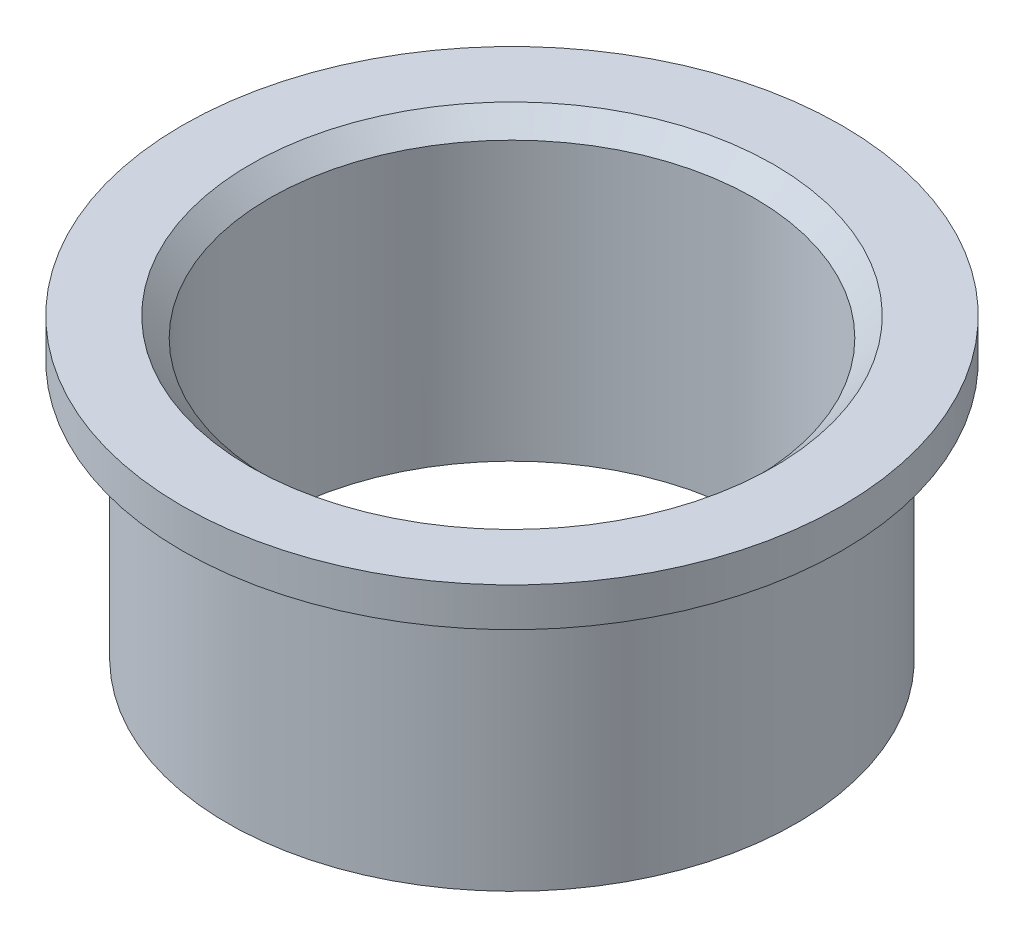
ISO-10303-21;
HEADER;
FILE_DESCRIPTION(('STEP AP214'),'2;1');
FILE_NAME('part.step','',(''),(''),'','','');
FILE_SCHEMA(('AUTOMOTIVE_DESIGN { 1 0 10303 214 1 1 1 1 }'));
ENDSEC;
DATA;
#1=APPLICATION_CONTEXT('core data for automotive mechanical design processes');
#2=APPLICATION_PROTOCOL_DEFINITION('international standard','automotive_design',2000,#1);
#3=PRODUCT_CONTEXT('',#1,'mechanical');
#4=PRODUCT('Part','Part','',(#3));
#5=PRODUCT_RELATED_PRODUCT_CATEGORY('part','',(#4));
#6=PRODUCT_DEFINITION_FORMATION('','',#4);
#7=PRODUCT_DEFINITION_CONTEXT('part definition',#1,'design');
#8=PRODUCT_DEFINITION('design','',#6,#7);
#9=PRODUCT_DEFINITION_SHAPE('','',#8);
#10=(LENGTH_UNIT() NAMED_UNIT(*) SI_UNIT(.MILLI.,.METRE.));
#11=(NAMED_UNIT(*) PLANE_ANGLE_UNIT() SI_UNIT($,.RADIAN.));
#12=(NAMED_UNIT(*) SI_UNIT($,.STERADIAN.) SOLID_ANGLE_UNIT());
#13=UNCERTAINTY_MEASURE_WITH_UNIT(LENGTH_MEASURE(1.E-05),#10,'distance_accuracy_value','');
#14=(GEOMETRIC_REPRESENTATION_CONTEXT(3) GLOBAL_UNCERTAINTY_ASSIGNED_CONTEXT((#13)) GLOBAL_UNIT_ASSIGNED_CONTEXT((#10,
#11,#12)) REPRESENTATION_CONTEXT('',''));
#15=CARTESIAN_POINT('',(0.,0.,0.));
#16=DIRECTION('',(0.,0.,1.));
#17=DIRECTION('',(1.,0.,0.));
#18=AXIS2_PLACEMENT_3D('',#15,#16,#17);
#19=CARTESIAN_POINT('',(44.,0.,0.));
#20=DIRECTION('',(0.,-1.,0.));
#21=DIRECTION('',(0.,0.,-1.));
#22=AXIS2_PLACEMENT_3D('',#19,#20,#21);
#23=PLANE('',#22);
#24=CARTESIAN_POINT('',(0.,0.,0.));
#25=DIRECTION('',(0.,-1.,0.));
#26=DIRECTION('',(0.,0.,-1.));
#27=AXIS2_PLACEMENT_3D('',#24,#25,#26);
#28=CIRCLE('',#27,44.);
#29=CARTESIAN_POINT('',(0.,0.,-44.));
#30=VERTEX_POINT('',#29);
#31=EDGE_CURVE('E78',#30,#30,#28,.T.);
#32=ORIENTED_EDGE('',*,*,#31,.T.);
#33=EDGE_LOOP('',(#32));
#34=FACE_BOUND('',#33,.T.);
#35=CARTESIAN_POINT('',(0.,0.,0.));
#36=DIRECTION('',(0.,-1.,0.));
#37=DIRECTION('',(0.,0.,-1.));
#38=AXIS2_PLACEMENT_3D('',#35,#36,#37);
#39=CIRCLE('',#38,37.5);
#40=CARTESIAN_POINT('',(0.,0.,-37.5));
#41=VERTEX_POINT('',#40);
#42=EDGE_CURVE('E59',#41,#41,#39,.T.);
#43=ORIENTED_EDGE('',*,*,#42,.F.);
#44=EDGE_LOOP('',(#43));
#45=FACE_BOUND('',#44,.T.);
#46=ADVANCED_FACE('F45',(#34,#45),#23,.T.);
#47=CARTESIAN_POINT('',(0.,0.,0.));
#48=DIRECTION('',(0.,-1.,0.));
#49=DIRECTION('',(0.,0.,-1.));
#50=AXIS2_PLACEMENT_3D('',#47,#48,#49);
#51=CYLINDRICAL_SURFACE('',#50,37.5);
#52=CARTESIAN_POINT('',(0.,43.,0.));
#53=DIRECTION('',(0.,1.,0.));
#54=DIRECTION('',(0.,0.,1.));
#55=AXIS2_PLACEMENT_3D('',#52,#53,#54);
#56=CIRCLE('',#55,37.5);
#57=CARTESIAN_POINT('',(0.,43.,37.5));
#58=VERTEX_POINT('',#57);
#59=EDGE_CURVE('E10',#58,#58,#56,.T.);
#60=ORIENTED_EDGE('',*,*,#59,.T.);
#61=EDGE_LOOP('',(#60));
#62=FACE_BOUND('',#61,.T.);
#63=ORIENTED_EDGE('',*,*,#42,.T.);
#64=EDGE_LOOP('',(#63));
#65=FACE_BOUND('',#64,.T.);
#66=ADVANCED_FACE('F100',(#62,#65),#51,.F.);
#67=CARTESIAN_POINT('',(37.5,46.,0.));
#68=DIRECTION('',(0.,1.,0.));
#69=DIRECTION('',(0.,0.,1.));
#70=AXIS2_PLACEMENT_3D('',#67,#68,#69);
#71=PLANE('',#70);
#72=CARTESIAN_POINT('',(0.,46.,0.));
#73=DIRECTION('',(0.,1.,0.));
#74=DIRECTION('',(0.,0.,1.));
#75=AXIS2_PLACEMENT_3D('',#72,#73,#74);
#76=CIRCLE('',#75,40.5);
#77=CARTESIAN_POINT('',(0.,46.,40.5));
#78=VERTEX_POINT('',#77);
#79=EDGE_CURVE('E54',#78,#78,#76,.F.);
#80=ORIENTED_EDGE('',*,*,#79,.T.);
#81=EDGE_LOOP('',(#80));
#82=FACE_BOUND('',#81,.T.);
#83=CARTESIAN_POINT('',(0.,46.,0.));
#84=DIRECTION('',(0.,-1.,0.));
#85=DIRECTION('',(0.,0.,-1.));
#86=AXIS2_PLACEMENT_3D('',#83,#84,#85);
#87=CIRCLE('',#86,51.);
#88=CARTESIAN_POINT('',(0.,46.,-51.));
#89=VERTEX_POINT('',#88);
#90=EDGE_CURVE('E64',#89,#89,#87,.T.);
#91=ORIENTED_EDGE('',*,*,#90,.F.);
#92=EDGE_LOOP('',(#91));
#93=FACE_BOUND('',#92,.T.);
#94=ADVANCED_FACE('F104',(#82,#93),#71,.T.);
#95=CARTESIAN_POINT('',(0.,0.,0.));
#96=DIRECTION('',(0.,-1.,0.));
#97=DIRECTION('',(0.,0.,-1.));
#98=AXIS2_PLACEMENT_3D('',#95,#96,#97);
#99=CYLINDRICAL_SURFACE('',#98,51.);
#100=ORIENTED_EDGE('',*,*,#90,.T.);
#101=EDGE_LOOP('',(#100));
#102=FACE_BOUND('',#101,.T.);
#103=CARTESIAN_POINT('',(0.,40.,0.));
#104=DIRECTION('',(0.,-1.,0.));
#105=DIRECTION('',(0.,0.,-1.));
#106=AXIS2_PLACEMENT_3D('',#103,#104,#105);
#107=CIRCLE('',#106,51.);
#108=CARTESIAN_POINT('',(0.,40.,-51.));
#109=VERTEX_POINT('',#108);
#110=EDGE_CURVE('E70',#109,#109,#107,.T.);
#111=ORIENTED_EDGE('',*,*,#110,.F.);
#112=EDGE_LOOP('',(#111));
#113=FACE_BOUND('',#112,.T.);
#114=ADVANCED_FACE('F96',(#102,#113),#99,.T.);
#115=CARTESIAN_POINT('',(51.,40.,0.));
#116=DIRECTION('',(0.,-1.,0.));
#117=DIRECTION('',(0.,0.,-1.));
#118=AXIS2_PLACEMENT_3D('',#115,#116,#117);
#119=PLANE('',#118);
#120=ORIENTED_EDGE('',*,*,#110,.T.);
#121=EDGE_LOOP('',(#120));
#122=FACE_BOUND('',#121,.T.);
#123=CARTESIAN_POINT('',(0.,40.,0.));
#124=DIRECTION('',(0.,-1.,0.));
#125=DIRECTION('',(0.,0.,-1.));
#126=AXIS2_PLACEMENT_3D('',#123,#124,#125);
#127=CIRCLE('',#126,44.);
#128=CARTESIAN_POINT('',(0.,40.,-44.));
#129=VERTEX_POINT('',#128);
#130=EDGE_CURVE('E74',#129,#129,#127,.T.);
#131=ORIENTED_EDGE('',*,*,#130,.F.);
#132=EDGE_LOOP('',(#131));
#133=FACE_BOUND('',#132,.T.);
#134=ADVANCED_FACE('F87',(#122,#133),#119,.T.);
#135=CARTESIAN_POINT('',(0.,0.,0.));
#136=DIRECTION('',(0.,-1.,0.));
#137=DIRECTION('',(0.,0.,-1.));
#138=AXIS2_PLACEMENT_3D('',#135,#136,#137);
#139=CYLINDRICAL_SURFACE('',#138,44.);
#140=ORIENTED_EDGE('',*,*,#130,.T.);
#141=EDGE_LOOP('',(#140));
#142=FACE_BOUND('',#141,.T.);
#143=ORIENTED_EDGE('',*,*,#31,.F.);
#144=EDGE_LOOP('',(#143));
#145=FACE_BOUND('',#144,.T.);
#146=ADVANCED_FACE('F85',(#142,#145),#139,.T.);
#147=CARTESIAN_POINT('',(0.,46.,0.));
#148=DIRECTION('',(0.,1.,0.));
#149=DIRECTION('',(0.,0.,1.));
#150=AXIS2_PLACEMENT_3D('',#147,#148,#149);
#151=CONICAL_SURFACE('',#150,40.5,0.785398163397447);
#152=ORIENTED_EDGE('',*,*,#59,.F.);
#153=EDGE_LOOP('',(#152));
#154=FACE_BOUND('',#153,.T.);
#155=ORIENTED_EDGE('',*,*,#79,.F.);
#156=EDGE_LOOP('',(#155));
#157=FACE_BOUND('',#156,.T.);
#158=ADVANCED_FACE('F48',(#154,#157),#151,.F.);
#159=CLOSED_SHELL('',(#46,#66,#94,#114,#134,#146,#158));
#160=MANIFOLD_SOLID_BREP('B2',#159);
#161=ADVANCED_BREP_SHAPE_REPRESENTATION('',(#18,#160),#14);
#162=SHAPE_DEFINITION_REPRESENTATION(#9,#161);
ENDSEC;
END-ISO-10303-21;
